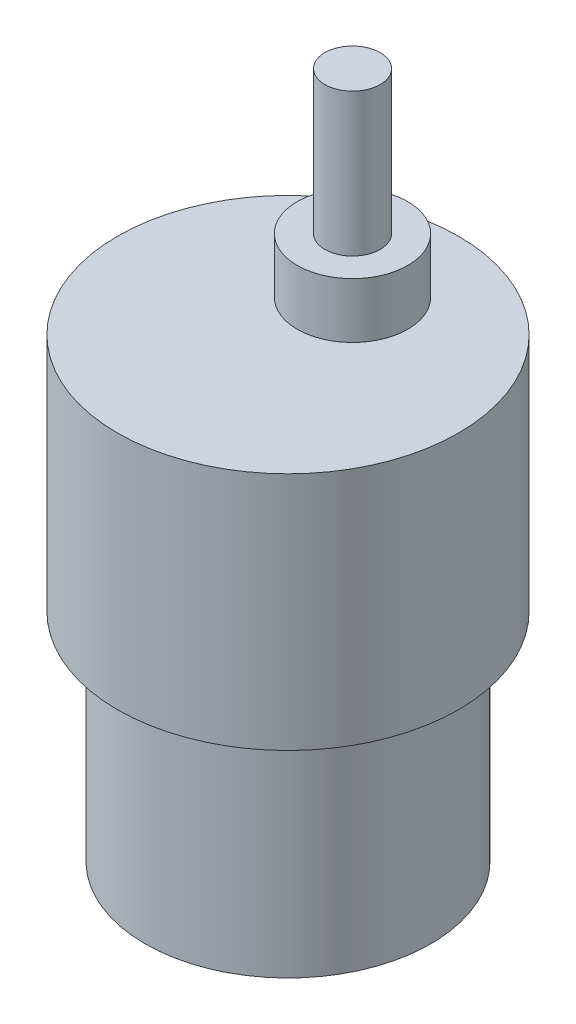
ISO-10303-21;
HEADER;
FILE_DESCRIPTION(('STEP AP214'),'2;1');
FILE_NAME('part.step','',(''),(''),'','','');
FILE_SCHEMA(('AUTOMOTIVE_DESIGN { 1 0 10303 214 1 1 1 1 }'));
ENDSEC;
DATA;
#1=APPLICATION_CONTEXT('core data for automotive mechanical design processes');
#2=APPLICATION_PROTOCOL_DEFINITION('international standard','automotive_design',2000,#1);
#3=PRODUCT_CONTEXT('',#1,'mechanical');
#4=PRODUCT('Part','Part','',(#3));
#5=PRODUCT_RELATED_PRODUCT_CATEGORY('part','',(#4));
#6=PRODUCT_DEFINITION_FORMATION('','',#4);
#7=PRODUCT_DEFINITION_CONTEXT('part definition',#1,'design');
#8=PRODUCT_DEFINITION('design','',#6,#7);
#9=PRODUCT_DEFINITION_SHAPE('','',#8);
#10=(LENGTH_UNIT() NAMED_UNIT(*) SI_UNIT(.MILLI.,.METRE.));
#11=(NAMED_UNIT(*) PLANE_ANGLE_UNIT() SI_UNIT($,.RADIAN.));
#12=(NAMED_UNIT(*) SI_UNIT($,.STERADIAN.) SOLID_ANGLE_UNIT());
#13=UNCERTAINTY_MEASURE_WITH_UNIT(LENGTH_MEASURE(1.E-05),#10,'distance_accuracy_value','');
#14=(GEOMETRIC_REPRESENTATION_CONTEXT(3) GLOBAL_UNCERTAINTY_ASSIGNED_CONTEXT((#13)) GLOBAL_UNIT_ASSIGNED_CONTEXT((#10,
#11,#12)) REPRESENTATION_CONTEXT('',''));
#15=CARTESIAN_POINT('',(0.,0.,0.));
#16=DIRECTION('',(0.,0.,1.));
#17=DIRECTION('',(1.,0.,0.));
#18=AXIS2_PLACEMENT_3D('',#15,#16,#17);
#19=CARTESIAN_POINT('',(0.,23.5,0.));
#20=DIRECTION('',(0.,-1.,0.));
#21=DIRECTION('',(0.,0.,-1.));
#22=AXIS2_PLACEMENT_3D('',#19,#20,#21);
#23=CYLINDRICAL_SURFACE('',#22,15.5);
#24=CARTESIAN_POINT('',(0.,23.5,0.));
#25=DIRECTION('',(0.,1.,0.));
#26=DIRECTION('',(0.,0.,1.));
#27=AXIS2_PLACEMENT_3D('',#24,#25,#26);
#28=CIRCLE('',#27,15.5);
#29=CARTESIAN_POINT('',(0.,23.5,15.5));
#30=VERTEX_POINT('',#29);
#31=EDGE_CURVE('E57',#30,#30,#28,.T.);
#32=ORIENTED_EDGE('',*,*,#31,.F.);
#33=EDGE_LOOP('',(#32));
#34=FACE_BOUND('',#33,.T.);
#35=CARTESIAN_POINT('',(0.,0.,0.));
#36=DIRECTION('',(0.,1.,0.));
#37=DIRECTION('',(0.,0.,1.));
#38=AXIS2_PLACEMENT_3D('',#35,#36,#37);
#39=CIRCLE('',#38,15.5);
#40=CARTESIAN_POINT('',(0.,0.,15.5));
#41=VERTEX_POINT('',#40);
#42=EDGE_CURVE('E46',#41,#41,#39,.T.);
#43=ORIENTED_EDGE('',*,*,#42,.T.);
#44=EDGE_LOOP('',(#43));
#45=FACE_BOUND('',#44,.T.);
#46=ADVANCED_FACE('F43',(#34,#45),#23,.T.);
#47=CARTESIAN_POINT('',(0.,0.,0.));
#48=DIRECTION('',(0.,1.,0.));
#49=DIRECTION('',(0.,0.,1.));
#50=AXIS2_PLACEMENT_3D('',#47,#48,#49);
#51=PLANE('',#50);
#52=ORIENTED_EDGE('',*,*,#42,.F.);
#53=EDGE_LOOP('',(#52));
#54=FACE_BOUND('',#53,.T.);
#55=ADVANCED_FACE('F82',(#54),#51,.F.);
#56=CARTESIAN_POINT('',(0.,49.5,0.));
#57=DIRECTION('',(0.,-1.,0.));
#58=DIRECTION('',(0.,0.,-1.));
#59=AXIS2_PLACEMENT_3D('',#56,#57,#58);
#60=CYLINDRICAL_SURFACE('',#59,18.5);
#61=CARTESIAN_POINT('',(0.,49.5,0.));
#62=DIRECTION('',(0.,1.,0.));
#63=DIRECTION('',(0.,0.,1.));
#64=AXIS2_PLACEMENT_3D('',#61,#62,#63);
#65=CIRCLE('',#64,18.5);
#66=CARTESIAN_POINT('',(0.,49.5,-18.5));
#67=VERTEX_POINT('',#66);
#68=EDGE_CURVE('E67',#67,#67,#65,.T.);
#69=CARTESIAN_POINT('',(0.,23.5,0.));
#70=DIRECTION('',(0.,1.,0.));
#71=DIRECTION('',(0.,0.,1.));
#72=AXIS2_PLACEMENT_3D('',#69,#70,#71);
#73=CIRCLE('',#72,18.5);
#74=CARTESIAN_POINT('',(0.,23.5,-18.5));
#75=VERTEX_POINT('',#74);
#76=EDGE_CURVE('E65',#75,#75,#73,.T.);
#77=CARTESIAN_POINT('',(0.,49.5,-18.5));
#78=CARTESIAN_POINT('',(0.,49.2291666666667,-18.5));
#79=CARTESIAN_POINT('',(0.,48.9583333333333,-18.5));
#80=CARTESIAN_POINT('',(0.,48.4166666666667,-18.5));
#81=CARTESIAN_POINT('',(0.,48.1458333333333,-18.5));
#82=CARTESIAN_POINT('',(0.,47.6041666666667,-18.5));
#83=CARTESIAN_POINT('',(0.,47.3333333333333,-18.5));
#84=CARTESIAN_POINT('',(0.,46.7916666666667,-18.5));
#85=CARTESIAN_POINT('',(0.,46.5208333333333,-18.5));
#86=CARTESIAN_POINT('',(0.,45.9791666666667,-18.5));
#87=CARTESIAN_POINT('',(0.,45.7083333333333,-18.5));
#88=CARTESIAN_POINT('',(0.,45.1666666666667,-18.5));
#89=CARTESIAN_POINT('',(0.,44.8958333333333,-18.5));
#90=CARTESIAN_POINT('',(0.,44.3541666666667,-18.5));
#91=CARTESIAN_POINT('',(0.,44.0833333333333,-18.5));
#92=CARTESIAN_POINT('',(0.,43.5416666666667,-18.5));
#93=CARTESIAN_POINT('',(0.,43.2708333333333,-18.5));
#94=CARTESIAN_POINT('',(0.,42.7291666666667,-18.5));
#95=CARTESIAN_POINT('',(0.,42.4583333333333,-18.5));
#96=CARTESIAN_POINT('',(0.,41.9166666666667,-18.5));
#97=CARTESIAN_POINT('',(0.,41.6458333333333,-18.5));
#98=CARTESIAN_POINT('',(0.,41.1041666666667,-18.5));
#99=CARTESIAN_POINT('',(0.,40.8333333333333,-18.5));
#100=CARTESIAN_POINT('',(0.,40.2916666666667,-18.5));
#101=CARTESIAN_POINT('',(0.,40.0208333333333,-18.5));
#102=CARTESIAN_POINT('',(0.,39.4791666666667,-18.5));
#103=CARTESIAN_POINT('',(0.,39.2083333333333,-18.5));
#104=CARTESIAN_POINT('',(0.,38.6666666666667,-18.5));
#105=CARTESIAN_POINT('',(0.,38.3958333333333,-18.5));
#106=CARTESIAN_POINT('',(0.,37.8541666666667,-18.5));
#107=CARTESIAN_POINT('',(0.,37.5833333333333,-18.5));
#108=CARTESIAN_POINT('',(0.,37.0416666666667,-18.5));
#109=CARTESIAN_POINT('',(0.,36.7708333333333,-18.5));
#110=CARTESIAN_POINT('',(0.,36.2291666666667,-18.5));
#111=CARTESIAN_POINT('',(0.,35.9583333333333,-18.5));
#112=CARTESIAN_POINT('',(0.,35.4166666666667,-18.5));
#113=CARTESIAN_POINT('',(0.,35.1458333333333,-18.5));
#114=CARTESIAN_POINT('',(0.,34.6041666666667,-18.5));
#115=CARTESIAN_POINT('',(0.,34.3333333333333,-18.5));
#116=CARTESIAN_POINT('',(0.,33.7916666666667,-18.5));
#117=CARTESIAN_POINT('',(0.,33.5208333333333,-18.5));
#118=CARTESIAN_POINT('',(0.,32.9791666666667,-18.5));
#119=CARTESIAN_POINT('',(0.,32.7083333333333,-18.5));
#120=CARTESIAN_POINT('',(0.,32.1666666666667,-18.5));
#121=CARTESIAN_POINT('',(0.,31.8958333333333,-18.5));
#122=CARTESIAN_POINT('',(0.,31.3541666666667,-18.5));
#123=CARTESIAN_POINT('',(0.,31.0833333333333,-18.5));
#124=CARTESIAN_POINT('',(0.,30.5416666666667,-18.5));
#125=CARTESIAN_POINT('',(0.,30.2708333333333,-18.5));
#126=CARTESIAN_POINT('',(0.,29.7291666666667,-18.5));
#127=CARTESIAN_POINT('',(0.,29.4583333333333,-18.5));
#128=CARTESIAN_POINT('',(0.,28.9166666666667,-18.5));
#129=CARTESIAN_POINT('',(0.,28.6458333333333,-18.5));
#130=CARTESIAN_POINT('',(0.,28.1041666666667,-18.5));
#131=CARTESIAN_POINT('',(0.,27.8333333333333,-18.5));
#132=CARTESIAN_POINT('',(0.,27.2916666666667,-18.5));
#133=CARTESIAN_POINT('',(0.,27.0208333333333,-18.5));
#134=CARTESIAN_POINT('',(0.,26.4791666666667,-18.5));
#135=CARTESIAN_POINT('',(0.,26.2083333333333,-18.5));
#136=CARTESIAN_POINT('',(0.,25.6666666666667,-18.5));
#137=CARTESIAN_POINT('',(0.,25.3958333333333,-18.5));
#138=CARTESIAN_POINT('',(0.,24.8541666666667,-18.5));
#139=CARTESIAN_POINT('',(0.,24.5833333333333,-18.5));
#140=CARTESIAN_POINT('',(0.,24.0416666666667,-18.5));
#141=CARTESIAN_POINT('',(0.,23.7708333333333,-18.5));
#142=CARTESIAN_POINT('',(0.,23.5,-18.5));
#143=B_SPLINE_CURVE_WITH_KNOTS('',3,(#77,#78,#79,#80,#81,#82,#83,#84,#85,#86,#87,#88,#89,#90,
#91,#92,#93,#94,#95,#96,#97,#98,#99,#100,#101,#102,#103,#104,#105,#106,#107,#108,#109,#110,#111,
#112,#113,#114,#115,#116,#117,#118,#119,#120,#121,#122,#123,#124,#125,#126,#127,#128,#129,#130,
#131,#132,#133,#134,#135,#136,#137,#138,#139,#140,#141,#142),.UNSPECIFIED.,.F.,.F.,(4,2,2,2,2,2,
2,2,2,2,2,2,2,2,2,2,2,2,2,2,2,2,2,2,2,2,2,2,2,2,2,2,4),(0.,0.812499999999994,1.62499999999999,
2.4375,3.25,4.0625,4.875,5.6875,6.5,7.3125,8.125,8.93749999999999,9.74999999999999,10.5625,
11.375,12.1875,13.,13.8125,14.625,15.4375,16.25,17.0625,17.875,18.6875,19.5,20.3125,21.125,
21.9375,22.75,23.5625,24.375,25.1875,26.),.UNSPECIFIED.);
#144=EDGE_CURVE('BSEAM84',#67,#75,#143,.T.);
#145=ORIENTED_EDGE('',*,*,#68,.F.);
#146=ORIENTED_EDGE('',*,*,#76,.T.);
#147=ORIENTED_EDGE('',*,*,#144,.T.);
#148=ORIENTED_EDGE('',*,*,#144,.F.);
#149=EDGE_LOOP('',(#145,#147,#146,#148));
#150=FACE_BOUND('',#149,.T.);
#151=ADVANCED_FACE('F84',(#150),#60,.T.);
#152=CARTESIAN_POINT('',(0.,49.5,0.));
#153=DIRECTION('',(0.,1.,0.));
#154=DIRECTION('',(0.,0.,1.));
#155=AXIS2_PLACEMENT_3D('',#152,#153,#154);
#156=PLANE('',#155);
#157=CARTESIAN_POINT('',(0.,49.5,-7.));
#158=DIRECTION('',(0.,1.,0.));
#159=DIRECTION('',(0.,0.,1.));
#160=AXIS2_PLACEMENT_3D('',#157,#158,#159);
#161=CIRCLE('',#160,6.);
#162=CARTESIAN_POINT('',(0.,49.5,-0.999999999999999));
#163=VERTEX_POINT('',#162);
#164=EDGE_CURVE('E51',#163,#163,#161,.T.);
#165=ORIENTED_EDGE('',*,*,#164,.F.);
#166=EDGE_LOOP('',(#165));
#167=FACE_BOUND('',#166,.T.);
#168=ORIENTED_EDGE('',*,*,#68,.T.);
#169=EDGE_LOOP('',(#168));
#170=FACE_BOUND('',#169,.T.);
#171=ADVANCED_FACE('F89',(#167,#170),#156,.T.);
#172=CARTESIAN_POINT('',(0.,23.5,0.));
#173=DIRECTION('',(0.,1.,0.));
#174=DIRECTION('',(0.,0.,1.));
#175=AXIS2_PLACEMENT_3D('',#172,#173,#174);
#176=PLANE('',#175);
#177=ORIENTED_EDGE('',*,*,#31,.T.);
#178=EDGE_LOOP('',(#177));
#179=FACE_BOUND('',#178,.T.);
#180=ORIENTED_EDGE('',*,*,#76,.F.);
#181=EDGE_LOOP('',(#180));
#182=FACE_BOUND('',#181,.T.);
#183=ADVANCED_FACE('F94',(#179,#182),#176,.F.);
#184=CARTESIAN_POINT('',(0.,55.5,-7.));
#185=DIRECTION('',(0.,-1.,0.));
#186=DIRECTION('',(0.,0.,-1.));
#187=AXIS2_PLACEMENT_3D('',#184,#185,#186);
#188=CYLINDRICAL_SURFACE('',#187,6.);
#189=CARTESIAN_POINT('',(0.,55.5,-7.));
#190=DIRECTION('',(0.,1.,0.));
#191=DIRECTION('',(0.,0.,1.));
#192=AXIS2_PLACEMENT_3D('',#189,#190,#191);
#193=CIRCLE('',#192,6.);
#194=CARTESIAN_POINT('',(0.,55.5,-0.999999999999999));
#195=VERTEX_POINT('',#194);
#196=EDGE_CURVE('E62',#195,#195,#193,.T.);
#197=ORIENTED_EDGE('',*,*,#196,.F.);
#198=EDGE_LOOP('',(#197));
#199=FACE_BOUND('',#198,.T.);
#200=ORIENTED_EDGE('',*,*,#164,.T.);
#201=EDGE_LOOP('',(#200));
#202=FACE_BOUND('',#201,.T.);
#203=ADVANCED_FACE('F97',(#199,#202),#188,.T.);
#204=CARTESIAN_POINT('',(0.,55.5,-7.));
#205=DIRECTION('',(0.,1.,0.));
#206=DIRECTION('',(0.,0.,1.));
#207=AXIS2_PLACEMENT_3D('',#204,#205,#206);
#208=PLANE('',#207);
#209=CARTESIAN_POINT('',(0.,55.5,-7.));
#210=DIRECTION('',(0.,1.,0.));
#211=DIRECTION('',(0.,0.,1.));
#212=AXIS2_PLACEMENT_3D('',#209,#210,#211);
#213=CIRCLE('',#212,3.);
#214=CARTESIAN_POINT('',(0.,55.5,-4.));
#215=VERTEX_POINT('',#214);
#216=EDGE_CURVE('E10',#215,#215,#213,.T.);
#217=ORIENTED_EDGE('',*,*,#216,.F.);
#218=EDGE_LOOP('',(#217));
#219=FACE_BOUND('',#218,.T.);
#220=ORIENTED_EDGE('',*,*,#196,.T.);
#221=EDGE_LOOP('',(#220));
#222=FACE_BOUND('',#221,.T.);
#223=ADVANCED_FACE('F103',(#219,#222),#208,.T.);
#224=CARTESIAN_POINT('',(0.,71.,-7.));
#225=DIRECTION('',(0.,-1.,0.));
#226=DIRECTION('',(0.,0.,-1.));
#227=AXIS2_PLACEMENT_3D('',#224,#225,#226);
#228=CYLINDRICAL_SURFACE('',#227,3.);
#229=CARTESIAN_POINT('',(0.,71.,-7.));
#230=DIRECTION('',(0.,1.,0.));
#231=DIRECTION('',(0.,0.,1.));
#232=AXIS2_PLACEMENT_3D('',#229,#230,#231);
#233=CIRCLE('',#232,3.);
#234=CARTESIAN_POINT('',(0.,71.,-4.));
#235=VERTEX_POINT('',#234);
#236=EDGE_CURVE('E61',#235,#235,#233,.T.);
#237=ORIENTED_EDGE('',*,*,#236,.F.);
#238=EDGE_LOOP('',(#237));
#239=FACE_BOUND('',#238,.T.);
#240=ORIENTED_EDGE('',*,*,#216,.T.);
#241=EDGE_LOOP('',(#240));
#242=FACE_BOUND('',#241,.T.);
#243=ADVANCED_FACE('F107',(#239,#242),#228,.T.);
#244=CARTESIAN_POINT('',(0.,71.,-7.));
#245=DIRECTION('',(0.,1.,0.));
#246=DIRECTION('',(0.,0.,1.));
#247=AXIS2_PLACEMENT_3D('',#244,#245,#246);
#248=PLANE('',#247);
#249=ORIENTED_EDGE('',*,*,#236,.T.);
#250=EDGE_LOOP('',(#249));
#251=FACE_BOUND('',#250,.T.);
#252=ADVANCED_FACE('F111',(#251),#248,.T.);
#253=CLOSED_SHELL('',(#46,#55,#151,#171,#183,#203,#223,#243,#252));
#254=MANIFOLD_SOLID_BREP('B2',#253);
#255=ADVANCED_BREP_SHAPE_REPRESENTATION('',(#18,#254),#14);
#256=SHAPE_DEFINITION_REPRESENTATION(#9,#255);
ENDSEC;
END-ISO-10303-21;
